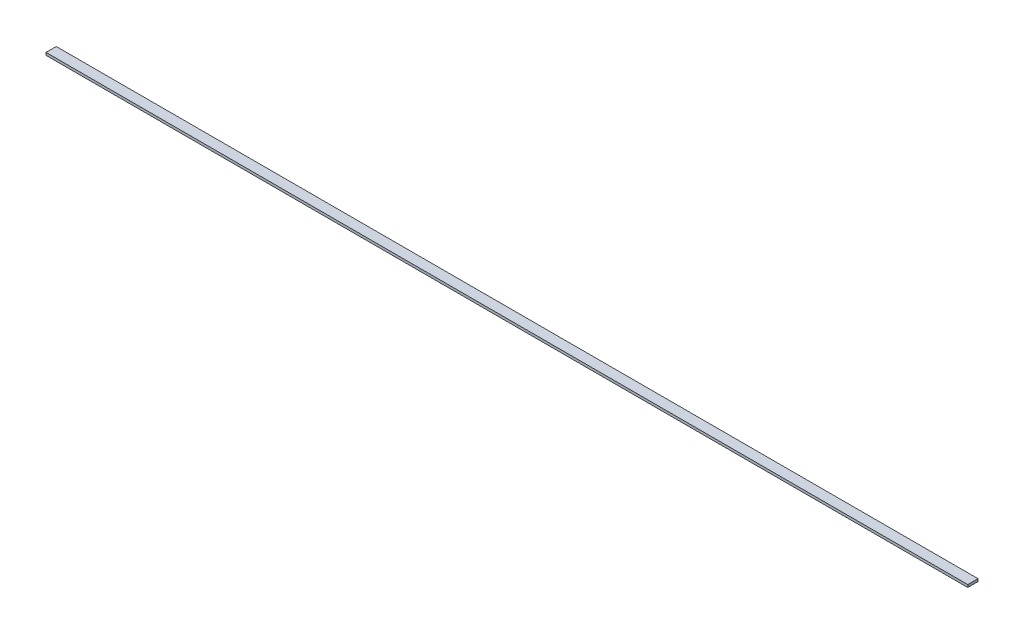
ISO-10303-21;
HEADER;
FILE_DESCRIPTION(('STEP AP214'),'2;1');
FILE_NAME('part.step','',(''),(''),'','','');
FILE_SCHEMA(('AUTOMOTIVE_DESIGN { 1 0 10303 214 1 1 1 1 }'));
ENDSEC;
DATA;
#1=APPLICATION_CONTEXT('core data for automotive mechanical design processes');
#2=APPLICATION_PROTOCOL_DEFINITION('international standard','automotive_design',2000,#1);
#3=PRODUCT_CONTEXT('',#1,'mechanical');
#4=PRODUCT('Part','Part','',(#3));
#5=PRODUCT_RELATED_PRODUCT_CATEGORY('part','',(#4));
#6=PRODUCT_DEFINITION_FORMATION('','',#4);
#7=PRODUCT_DEFINITION_CONTEXT('part definition',#1,'design');
#8=PRODUCT_DEFINITION('design','',#6,#7);
#9=PRODUCT_DEFINITION_SHAPE('','',#8);
#10=(LENGTH_UNIT() NAMED_UNIT(*) SI_UNIT(.MILLI.,.METRE.));
#11=(NAMED_UNIT(*) PLANE_ANGLE_UNIT() SI_UNIT($,.RADIAN.));
#12=(NAMED_UNIT(*) SI_UNIT($,.STERADIAN.) SOLID_ANGLE_UNIT());
#13=UNCERTAINTY_MEASURE_WITH_UNIT(LENGTH_MEASURE(1.E-05),#10,'distance_accuracy_value','');
#14=(GEOMETRIC_REPRESENTATION_CONTEXT(3) GLOBAL_UNCERTAINTY_ASSIGNED_CONTEXT((#13)) GLOBAL_UNIT_ASSIGNED_CONTEXT((#10,
#11,#12)) REPRESENTATION_CONTEXT('',''));
#15=CARTESIAN_POINT('',(0.,0.,0.));
#16=DIRECTION('',(0.,0.,1.));
#17=DIRECTION('',(1.,0.,0.));
#18=AXIS2_PLACEMENT_3D('',#15,#16,#17);
#19=CARTESIAN_POINT('',(1143.,6.35,12.7));
#20=DIRECTION('',(-1.,0.,0.));
#21=DIRECTION('',(0.,0.,1.));
#22=AXIS2_PLACEMENT_3D('',#19,#20,#21);
#23=PLANE('',#22);
#24=DIRECTION('',(0.,0.,-1.));
#25=VECTOR('',#24,1.);
#26=CARTESIAN_POINT('',(1143.,0.,12.7));
#27=LINE('',#26,#25);
#28=CARTESIAN_POINT('',(1143.,0.,12.7));
#29=VERTEX_POINT('',#28);
#30=CARTESIAN_POINT('',(1143.,0.,-12.7));
#31=VERTEX_POINT('',#30);
#32=EDGE_CURVE('E98',#29,#31,#27,.T.);
#33=ORIENTED_EDGE('',*,*,#32,.T.);
#34=DIRECTION('',(0.,-1.,0.));
#35=VECTOR('',#34,1.);
#36=CARTESIAN_POINT('',(1143.,6.35,-12.7));
#37=LINE('',#36,#35);
#38=CARTESIAN_POINT('',(1143.,6.35,-12.7));
#39=VERTEX_POINT('',#38);
#40=EDGE_CURVE('E11',#39,#31,#37,.T.);
#41=ORIENTED_EDGE('',*,*,#40,.F.);
#42=DIRECTION('',(0.,0.,-1.));
#43=VECTOR('',#42,1.);
#44=CARTESIAN_POINT('',(1143.,6.35,12.7));
#45=LINE('',#44,#43);
#46=CARTESIAN_POINT('',(1143.,6.35,12.7));
#47=VERTEX_POINT('',#46);
#48=EDGE_CURVE('E86',#47,#39,#45,.T.);
#49=ORIENTED_EDGE('',*,*,#48,.F.);
#50=DIRECTION('',(0.,-1.,0.));
#51=VECTOR('',#50,1.);
#52=CARTESIAN_POINT('',(1143.,6.35,12.7));
#53=LINE('',#52,#51);
#54=EDGE_CURVE('E94',#47,#29,#53,.T.);
#55=ORIENTED_EDGE('',*,*,#54,.T.);
#56=EDGE_LOOP('',(#33,#41,#49,#55));
#57=FACE_BOUND('',#56,.T.);
#58=ADVANCED_FACE('F35',(#57),#23,.F.);
#59=CARTESIAN_POINT('',(-1143.,6.35,-12.7));
#60=DIRECTION('',(0.,0.,1.));
#61=DIRECTION('',(1.,0.,0.));
#62=AXIS2_PLACEMENT_3D('',#59,#60,#61);
#63=PLANE('',#62);
#64=DIRECTION('',(-1.,0.,0.));
#65=VECTOR('',#64,1.);
#66=CARTESIAN_POINT('',(-1143.,0.,-12.7));
#67=LINE('',#66,#65);
#68=CARTESIAN_POINT('',(-1143.,0.,-12.7));
#69=VERTEX_POINT('',#68);
#70=EDGE_CURVE('E90',#31,#69,#67,.T.);
#71=ORIENTED_EDGE('',*,*,#70,.T.);
#72=DIRECTION('',(0.,-1.,0.));
#73=VECTOR('',#72,1.);
#74=CARTESIAN_POINT('',(-1143.,6.35,-12.7));
#75=LINE('',#74,#73);
#76=CARTESIAN_POINT('',(-1143.,6.35,-12.7));
#77=VERTEX_POINT('',#76);
#78=EDGE_CURVE('E43',#77,#69,#75,.T.);
#79=ORIENTED_EDGE('',*,*,#78,.F.);
#80=DIRECTION('',(-1.,0.,0.));
#81=VECTOR('',#80,1.);
#82=CARTESIAN_POINT('',(-1143.,6.35,-12.7));
#83=LINE('',#82,#81);
#84=EDGE_CURVE('E81',#39,#77,#83,.T.);
#85=ORIENTED_EDGE('',*,*,#84,.F.);
#86=ORIENTED_EDGE('',*,*,#40,.T.);
#87=EDGE_LOOP('',(#71,#79,#85,#86));
#88=FACE_BOUND('',#87,.T.);
#89=ADVANCED_FACE('F89',(#88),#63,.F.);
#90=CARTESIAN_POINT('',(-1143.,6.35,12.7));
#91=DIRECTION('',(1.,0.,0.));
#92=DIRECTION('',(0.,0.,-1.));
#93=AXIS2_PLACEMENT_3D('',#90,#91,#92);
#94=PLANE('',#93);
#95=DIRECTION('',(0.,0.,1.));
#96=VECTOR('',#95,1.);
#97=CARTESIAN_POINT('',(-1143.,0.,12.7));
#98=LINE('',#97,#96);
#99=CARTESIAN_POINT('',(-1143.,0.,12.7));
#100=VERTEX_POINT('',#99);
#101=EDGE_CURVE('E68',#69,#100,#98,.T.);
#102=ORIENTED_EDGE('',*,*,#101,.T.);
#103=DIRECTION('',(0.,-1.,0.));
#104=VECTOR('',#103,1.);
#105=CARTESIAN_POINT('',(-1143.,6.35,12.7));
#106=LINE('',#105,#104);
#107=CARTESIAN_POINT('',(-1143.,6.35,12.7));
#108=VERTEX_POINT('',#107);
#109=EDGE_CURVE('E91',#108,#100,#106,.T.);
#110=ORIENTED_EDGE('',*,*,#109,.F.);
#111=DIRECTION('',(0.,0.,1.));
#112=VECTOR('',#111,1.);
#113=CARTESIAN_POINT('',(-1143.,6.35,12.7));
#114=LINE('',#113,#112);
#115=EDGE_CURVE('E84',#77,#108,#114,.T.);
#116=ORIENTED_EDGE('',*,*,#115,.F.);
#117=ORIENTED_EDGE('',*,*,#78,.T.);
#118=EDGE_LOOP('',(#102,#110,#116,#117));
#119=FACE_BOUND('',#118,.T.);
#120=ADVANCED_FACE('F92',(#119),#94,.F.);
#121=CARTESIAN_POINT('',(-1143.,6.35,12.7));
#122=DIRECTION('',(0.,0.,-1.));
#123=DIRECTION('',(-1.,0.,0.));
#124=AXIS2_PLACEMENT_3D('',#121,#122,#123);
#125=PLANE('',#124);
#126=DIRECTION('',(1.,0.,0.));
#127=VECTOR('',#126,1.);
#128=CARTESIAN_POINT('',(-1143.,0.,12.7));
#129=LINE('',#128,#127);
#130=EDGE_CURVE('E74',#100,#29,#129,.T.);
#131=ORIENTED_EDGE('',*,*,#130,.T.);
#132=ORIENTED_EDGE('',*,*,#54,.F.);
#133=DIRECTION('',(1.,0.,0.));
#134=VECTOR('',#133,1.);
#135=CARTESIAN_POINT('',(-1143.,6.35,12.7));
#136=LINE('',#135,#134);
#137=EDGE_CURVE('E51',#108,#47,#136,.T.);
#138=ORIENTED_EDGE('',*,*,#137,.F.);
#139=ORIENTED_EDGE('',*,*,#109,.T.);
#140=EDGE_LOOP('',(#131,#132,#138,#139));
#141=FACE_BOUND('',#140,.T.);
#142=ADVANCED_FACE('F105',(#141),#125,.F.);
#143=CARTESIAN_POINT('',(0.,6.35,0.));
#144=DIRECTION('',(0.,-1.,0.));
#145=DIRECTION('',(0.,0.,-1.));
#146=AXIS2_PLACEMENT_3D('',#143,#144,#145);
#147=PLANE('',#146);
#148=ORIENTED_EDGE('',*,*,#48,.T.);
#149=ORIENTED_EDGE('',*,*,#84,.T.);
#150=ORIENTED_EDGE('',*,*,#115,.T.);
#151=ORIENTED_EDGE('',*,*,#137,.T.);
#152=EDGE_LOOP('',(#148,#149,#150,#151));
#153=FACE_BOUND('',#152,.T.);
#154=ADVANCED_FACE('F82',(#153),#147,.F.);
#155=CARTESIAN_POINT('',(0.,0.,0.));
#156=DIRECTION('',(0.,-1.,0.));
#157=DIRECTION('',(0.,0.,-1.));
#158=AXIS2_PLACEMENT_3D('',#155,#156,#157);
#159=PLANE('',#158);
#160=ORIENTED_EDGE('',*,*,#32,.F.);
#161=ORIENTED_EDGE('',*,*,#130,.F.);
#162=ORIENTED_EDGE('',*,*,#101,.F.);
#163=ORIENTED_EDGE('',*,*,#70,.F.);
#164=EDGE_LOOP('',(#160,#161,#162,#163));
#165=FACE_BOUND('',#164,.T.);
#166=ADVANCED_FACE('F108',(#165),#159,.T.);
#167=CLOSED_SHELL('',(#58,#89,#120,#142,#154,#166));
#168=MANIFOLD_SOLID_BREP('B2',#167);
#169=ADVANCED_BREP_SHAPE_REPRESENTATION('',(#18,#168),#14);
#170=SHAPE_DEFINITION_REPRESENTATION(#9,#169);
ENDSEC;
END-ISO-10303-21;
